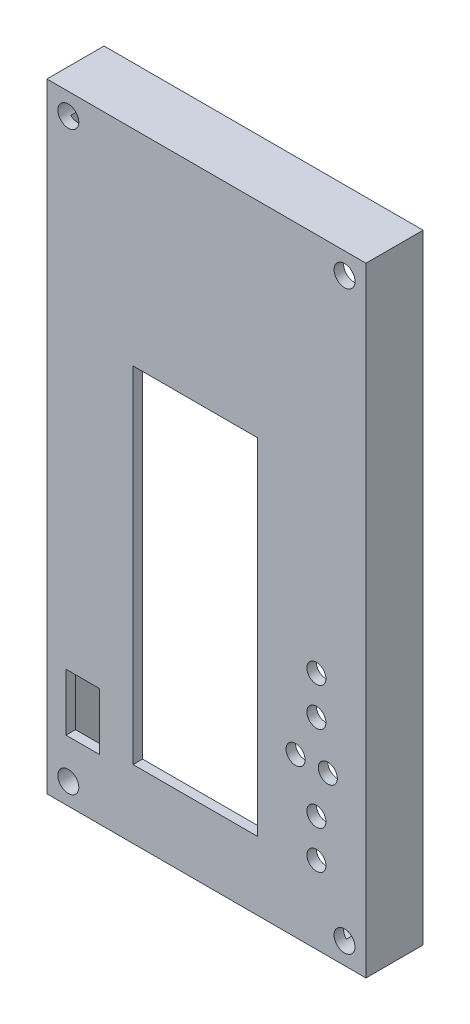
ISO-10303-21;
HEADER;
FILE_DESCRIPTION(('STEP AP214'),'2;1');
FILE_NAME('part.step','',(''),(''),'','','');
FILE_SCHEMA(('AUTOMOTIVE_DESIGN { 1 0 10303 214 1 1 1 1 }'));
ENDSEC;
DATA;
#1=APPLICATION_CONTEXT('core data for automotive mechanical design processes');
#2=APPLICATION_PROTOCOL_DEFINITION('international standard','automotive_design',2000,#1);
#3=PRODUCT_CONTEXT('',#1,'mechanical');
#4=PRODUCT('Part','Part','',(#3));
#5=PRODUCT_RELATED_PRODUCT_CATEGORY('part','',(#4));
#6=PRODUCT_DEFINITION_FORMATION('','',#4);
#7=PRODUCT_DEFINITION_CONTEXT('part definition',#1,'design');
#8=PRODUCT_DEFINITION('design','',#6,#7);
#9=PRODUCT_DEFINITION_SHAPE('','',#8);
#10=(LENGTH_UNIT() NAMED_UNIT(*) SI_UNIT(.MILLI.,.METRE.));
#11=(NAMED_UNIT(*) PLANE_ANGLE_UNIT() SI_UNIT($,.RADIAN.));
#12=(NAMED_UNIT(*) SI_UNIT($,.STERADIAN.) SOLID_ANGLE_UNIT());
#13=UNCERTAINTY_MEASURE_WITH_UNIT(LENGTH_MEASURE(1.E-05),#10,'distance_accuracy_value','');
#14=(GEOMETRIC_REPRESENTATION_CONTEXT(3) GLOBAL_UNCERTAINTY_ASSIGNED_CONTEXT((#13)) GLOBAL_UNIT_ASSIGNED_CONTEXT((#10,
#11,#12)) REPRESENTATION_CONTEXT('',''));
#15=CARTESIAN_POINT('',(0.,0.,0.));
#16=DIRECTION('',(0.,0.,1.));
#17=DIRECTION('',(1.,0.,0.));
#18=AXIS2_PLACEMENT_3D('',#15,#16,#17);
#19=CARTESIAN_POINT('',(0.,0.,0.));
#20=DIRECTION('',(0.,0.,-1.));
#21=DIRECTION('',(-1.,0.,0.));
#22=AXIS2_PLACEMENT_3D('',#19,#20,#21);
#23=PLANE('',#22);
#24=CARTESIAN_POINT('',(29.0000000000004,57.1675022635253,0.));
#25=DIRECTION('',(0.,0.,1.));
#26=DIRECTION('',(1.,0.,0.));
#27=AXIS2_PLACEMENT_3D('',#24,#25,#26);
#28=CIRCLE('',#27,2.2);
#29=CARTESIAN_POINT('',(30.5000000000004,55.5581545695822,0.));
#30=VERTEX_POINT('',#29);
#31=CARTESIAN_POINT('',(27.3906523060562,58.6675022635241,0.));
#32=VERTEX_POINT('',#31);
#33=EDGE_CURVE('E197',#30,#32,#28,.T.);
#34=ORIENTED_EDGE('',*,*,#33,.T.);
#35=DIRECTION('',(-1.,0.,0.));
#36=VECTOR('',#35,1.);
#37=CARTESIAN_POINT('',(-30.5000000000004,58.6675022635241,0.));
#38=LINE('',#37,#36);
#39=CARTESIAN_POINT('',(-27.390652306057,58.6675022635241,0.));
#40=VERTEX_POINT('',#39);
#41=EDGE_CURVE('E190',#32,#40,#38,.T.);
#42=ORIENTED_EDGE('',*,*,#41,.T.);
#43=CARTESIAN_POINT('',(-29.0000000000006,57.1675022635246,0.));
#44=DIRECTION('',(0.,0.,1.));
#45=DIRECTION('',(1.,0.,0.));
#46=AXIS2_PLACEMENT_3D('',#43,#44,#45);
#47=CIRCLE('',#46,2.2);
#48=CARTESIAN_POINT('',(-30.5000000000004,55.5581545695813,0.));
#49=VERTEX_POINT('',#48);
#50=EDGE_CURVE('E170',#40,#49,#47,.T.);
#51=ORIENTED_EDGE('',*,*,#50,.T.);
#52=DIRECTION('',(0.,-1.,0.));
#53=VECTOR('',#52,1.);
#54=CARTESIAN_POINT('',(-30.5000000000004,-65.3324977364759,0.));
#55=LINE('',#54,#53);
#56=CARTESIAN_POINT('',(-30.5000000000004,-62.2231500425326,0.));
#57=VERTEX_POINT('',#56);
#58=EDGE_CURVE('E254',#49,#57,#55,.T.);
#59=ORIENTED_EDGE('',*,*,#58,.T.);
#60=CARTESIAN_POINT('',(-29.0000000000006,-63.8324977364759,0.));
#61=DIRECTION('',(0.,0.,1.));
#62=DIRECTION('',(1.,0.,0.));
#63=AXIS2_PLACEMENT_3D('',#60,#61,#62);
#64=CIRCLE('',#63,2.2);
#65=CARTESIAN_POINT('',(-27.3906523060574,-65.3324977364759,0.));
#66=VERTEX_POINT('',#65);
#67=EDGE_CURVE('E268',#57,#66,#64,.T.);
#68=ORIENTED_EDGE('',*,*,#67,.T.);
#69=DIRECTION('',(1.,0.,0.));
#70=VECTOR('',#69,1.);
#71=CARTESIAN_POINT('',(-30.5000000000004,-65.3324977364759,0.));
#72=LINE('',#71,#70);
#73=CARTESIAN_POINT('',(27.3906523060573,-65.3324977364759,0.));
#74=VERTEX_POINT('',#73);
#75=EDGE_CURVE('E204',#66,#74,#72,.T.);
#76=ORIENTED_EDGE('',*,*,#75,.T.);
#77=CARTESIAN_POINT('',(29.0000000000004,-63.8324977364759,0.));
#78=DIRECTION('',(0.,0.,1.));
#79=DIRECTION('',(1.,0.,0.));
#80=AXIS2_PLACEMENT_3D('',#77,#78,#79);
#81=CIRCLE('',#80,2.2);
#82=CARTESIAN_POINT('',(30.5000000000004,-62.2231500425328,0.));
#83=VERTEX_POINT('',#82);
#84=EDGE_CURVE('E266',#74,#83,#81,.T.);
#85=ORIENTED_EDGE('',*,*,#84,.T.);
#86=DIRECTION('',(0.,1.,0.));
#87=VECTOR('',#86,1.);
#88=CARTESIAN_POINT('',(30.5000000000004,-65.3324977364759,0.));
#89=LINE('',#88,#87);
#90=EDGE_CURVE('E199',#83,#30,#89,.T.);
#91=ORIENTED_EDGE('',*,*,#90,.T.);
#92=EDGE_LOOP('',(#34,#42,#51,#59,#68,#76,#85,#91));
#93=FACE_BOUND('',#92,.T.);
#94=DIRECTION('',(0.,-1.,0.));
#95=VECTOR('',#94,1.);
#96=CARTESIAN_POINT('',(-33.5000000000004,-68.3324977364759,0.));
#97=LINE('',#96,#95);
#98=CARTESIAN_POINT('',(-33.5000000000004,61.6675022635241,0.));
#99=VERTEX_POINT('',#98);
#100=CARTESIAN_POINT('',(-33.5000000000004,-68.3324977364759,0.));
#101=VERTEX_POINT('',#100);
#102=EDGE_CURVE('E208',#99,#101,#97,.T.);
#103=ORIENTED_EDGE('',*,*,#102,.F.);
#104=DIRECTION('',(-1.,0.,0.));
#105=VECTOR('',#104,1.);
#106=CARTESIAN_POINT('',(-33.5000000000004,61.6675022635241,0.));
#107=LINE('',#106,#105);
#108=CARTESIAN_POINT('',(33.5000000000004,61.6675022635241,0.));
#109=VERTEX_POINT('',#108);
#110=EDGE_CURVE('E215',#109,#99,#107,.T.);
#111=ORIENTED_EDGE('',*,*,#110,.F.);
#112=DIRECTION('',(0.,1.,0.));
#113=VECTOR('',#112,1.);
#114=CARTESIAN_POINT('',(33.5000000000004,-68.3324977364759,0.));
#115=LINE('',#114,#113);
#116=CARTESIAN_POINT('',(33.5000000000004,-68.3324977364759,0.));
#117=VERTEX_POINT('',#116);
#118=EDGE_CURVE('E213',#117,#109,#115,.T.);
#119=ORIENTED_EDGE('',*,*,#118,.F.);
#120=DIRECTION('',(1.,0.,0.));
#121=VECTOR('',#120,1.);
#122=CARTESIAN_POINT('',(-33.5000000000004,-68.3324977364759,0.));
#123=LINE('',#122,#121);
#124=EDGE_CURVE('E211',#101,#117,#123,.T.);
#125=ORIENTED_EDGE('',*,*,#124,.F.);
#126=EDGE_LOOP('',(#103,#111,#119,#125));
#127=FACE_BOUND('',#126,.T.);
#128=ADVANCED_FACE('F34',(#93,#127),#23,.T.);
#129=CARTESIAN_POINT('',(-33.5000000000004,-68.3324977364759,10.));
#130=DIRECTION('',(1.,0.,0.));
#131=DIRECTION('',(0.,0.,-1.));
#132=AXIS2_PLACEMENT_3D('',#129,#130,#131);
#133=PLANE('',#132);
#134=ORIENTED_EDGE('',*,*,#102,.T.);
#135=DIRECTION('',(0.,0.,-1.));
#136=VECTOR('',#135,1.);
#137=CARTESIAN_POINT('',(-33.5000000000004,-68.3324977364759,10.));
#138=LINE('',#137,#136);
#139=CARTESIAN_POINT('',(-33.5000000000004,-68.3324977364759,12.));
#140=VERTEX_POINT('',#139);
#141=EDGE_CURVE('E11',#140,#101,#138,.T.);
#142=ORIENTED_EDGE('',*,*,#141,.F.);
#143=DIRECTION('',(0.,-1.,0.));
#144=VECTOR('',#143,1.);
#145=CARTESIAN_POINT('',(-33.5000000000004,-68.3324977364759,12.));
#146=LINE('',#145,#144);
#147=CARTESIAN_POINT('',(-33.5000000000004,61.6675022635241,12.));
#148=VERTEX_POINT('',#147);
#149=EDGE_CURVE('E241',#148,#140,#146,.T.);
#150=ORIENTED_EDGE('',*,*,#149,.F.);
#151=DIRECTION('',(0.,0.,-1.));
#152=VECTOR('',#151,1.);
#153=CARTESIAN_POINT('',(-33.5000000000004,61.6675022635241,10.));
#154=LINE('',#153,#152);
#155=EDGE_CURVE('E217',#148,#99,#154,.T.);
#156=ORIENTED_EDGE('',*,*,#155,.T.);
#157=EDGE_LOOP('',(#134,#142,#150,#156));
#158=FACE_BOUND('',#157,.T.);
#159=ADVANCED_FACE('F36',(#158),#133,.F.);
#160=CARTESIAN_POINT('',(-33.5000000000004,-68.3324977364759,10.));
#161=DIRECTION('',(0.,1.,0.));
#162=DIRECTION('',(0.,0.,1.));
#163=AXIS2_PLACEMENT_3D('',#160,#161,#162);
#164=PLANE('',#163);
#165=ORIENTED_EDGE('',*,*,#124,.T.);
#166=DIRECTION('',(0.,0.,-1.));
#167=VECTOR('',#166,1.);
#168=CARTESIAN_POINT('',(33.5000000000004,-68.3324977364759,10.));
#169=LINE('',#168,#167);
#170=CARTESIAN_POINT('',(33.5000000000004,-68.3324977364759,12.));
#171=VERTEX_POINT('',#170);
#172=EDGE_CURVE('E42',#171,#117,#169,.T.);
#173=ORIENTED_EDGE('',*,*,#172,.F.);
#174=DIRECTION('',(1.,0.,0.));
#175=VECTOR('',#174,1.);
#176=CARTESIAN_POINT('',(-33.5000000000004,-68.3324977364759,12.));
#177=LINE('',#176,#175);
#178=EDGE_CURVE('E243',#140,#171,#177,.T.);
#179=ORIENTED_EDGE('',*,*,#178,.F.);
#180=ORIENTED_EDGE('',*,*,#141,.T.);
#181=EDGE_LOOP('',(#165,#173,#179,#180));
#182=FACE_BOUND('',#181,.T.);
#183=ADVANCED_FACE('F439',(#182),#164,.F.);
#184=CARTESIAN_POINT('',(33.5000000000004,-68.3324977364759,10.));
#185=DIRECTION('',(-1.,0.,0.));
#186=DIRECTION('',(0.,0.,1.));
#187=AXIS2_PLACEMENT_3D('',#184,#185,#186);
#188=PLANE('',#187);
#189=ORIENTED_EDGE('',*,*,#118,.T.);
#190=DIRECTION('',(0.,0.,-1.));
#191=VECTOR('',#190,1.);
#192=CARTESIAN_POINT('',(33.5000000000004,61.6675022635241,10.));
#193=LINE('',#192,#191);
#194=CARTESIAN_POINT('',(33.5000000000004,61.6675022635241,12.));
#195=VERTEX_POINT('',#194);
#196=EDGE_CURVE('E220',#195,#109,#193,.T.);
#197=ORIENTED_EDGE('',*,*,#196,.F.);
#198=DIRECTION('',(0.,1.,0.));
#199=VECTOR('',#198,1.);
#200=CARTESIAN_POINT('',(33.5000000000004,-68.3324977364759,12.));
#201=LINE('',#200,#199);
#202=EDGE_CURVE('E228',#171,#195,#201,.T.);
#203=ORIENTED_EDGE('',*,*,#202,.F.);
#204=ORIENTED_EDGE('',*,*,#172,.T.);
#205=EDGE_LOOP('',(#189,#197,#203,#204));
#206=FACE_BOUND('',#205,.T.);
#207=ADVANCED_FACE('F226',(#206),#188,.F.);
#208=CARTESIAN_POINT('',(-33.5000000000004,61.6675022635241,10.));
#209=DIRECTION('',(0.,-1.,0.));
#210=DIRECTION('',(0.,0.,-1.));
#211=AXIS2_PLACEMENT_3D('',#208,#209,#210);
#212=PLANE('',#211);
#213=ORIENTED_EDGE('',*,*,#110,.T.);
#214=ORIENTED_EDGE('',*,*,#155,.F.);
#215=DIRECTION('',(-1.,0.,0.));
#216=VECTOR('',#215,1.);
#217=CARTESIAN_POINT('',(-33.5000000000004,61.6675022635241,12.));
#218=LINE('',#217,#216);
#219=EDGE_CURVE('E253',#195,#148,#218,.T.);
#220=ORIENTED_EDGE('',*,*,#219,.F.);
#221=ORIENTED_EDGE('',*,*,#196,.T.);
#222=EDGE_LOOP('',(#213,#214,#220,#221));
#223=FACE_BOUND('',#222,.T.);
#224=ADVANCED_FACE('F235',(#223),#212,.F.);
#225=CARTESIAN_POINT('',(-30.5000000000004,-65.3324977364759,10.));
#226=DIRECTION('',(1.,0.,0.));
#227=DIRECTION('',(0.,0.,-1.));
#228=AXIS2_PLACEMENT_3D('',#225,#226,#227);
#229=PLANE('',#228);
#230=DIRECTION('',(0.,0.,1.));
#231=VECTOR('',#230,1.);
#232=CARTESIAN_POINT('',(-30.5000000000004,-62.2231500425326,0.));
#233=LINE('',#232,#231);
#234=CARTESIAN_POINT('',(-30.5000000000004,-62.2231500425326,10.));
#235=VERTEX_POINT('',#234);
#236=EDGE_CURVE('E283',#57,#235,#233,.T.);
#237=ORIENTED_EDGE('',*,*,#236,.F.);
#238=ORIENTED_EDGE('',*,*,#58,.F.);
#239=DIRECTION('',(0.,0.,1.));
#240=VECTOR('',#239,1.);
#241=CARTESIAN_POINT('',(-30.5000000000004,55.5581545695813,0.));
#242=LINE('',#241,#240);
#243=CARTESIAN_POINT('',(-30.5000000000004,55.5581545695813,10.));
#244=VERTEX_POINT('',#243);
#245=EDGE_CURVE('E177',#244,#49,#242,.F.);
#246=ORIENTED_EDGE('',*,*,#245,.F.);
#247=DIRECTION('',(0.,-1.,0.));
#248=VECTOR('',#247,1.);
#249=CARTESIAN_POINT('',(-30.5000000000004,-65.3324977364759,10.));
#250=LINE('',#249,#248);
#251=EDGE_CURVE('E198',#244,#235,#250,.T.);
#252=ORIENTED_EDGE('',*,*,#251,.T.);
#253=EDGE_LOOP('',(#237,#238,#246,#252));
#254=FACE_BOUND('',#253,.T.);
#255=ADVANCED_FACE('F442',(#254),#229,.T.);
#256=CARTESIAN_POINT('',(-30.5000000000004,-65.3324977364759,10.));
#257=DIRECTION('',(0.,1.,0.));
#258=DIRECTION('',(0.,0.,1.));
#259=AXIS2_PLACEMENT_3D('',#256,#257,#258);
#260=PLANE('',#259);
#261=DIRECTION('',(0.,0.,1.));
#262=VECTOR('',#261,1.);
#263=CARTESIAN_POINT('',(-27.3906523060574,-65.3324977364759,0.));
#264=LINE('',#263,#262);
#265=CARTESIAN_POINT('',(-27.3906523060574,-65.3324977364759,10.));
#266=VERTEX_POINT('',#265);
#267=EDGE_CURVE('E272',#266,#66,#264,.F.);
#268=ORIENTED_EDGE('',*,*,#267,.F.);
#269=DIRECTION('',(1.,0.,0.));
#270=VECTOR('',#269,1.);
#271=CARTESIAN_POINT('',(-30.5000000000004,-65.3324977364759,10.));
#272=LINE('',#271,#270);
#273=CARTESIAN_POINT('',(27.3906523060573,-65.3324977364759,10.));
#274=VERTEX_POINT('',#273);
#275=EDGE_CURVE('E202',#266,#274,#272,.T.);
#276=ORIENTED_EDGE('',*,*,#275,.T.);
#277=DIRECTION('',(0.,0.,1.));
#278=VECTOR('',#277,1.);
#279=CARTESIAN_POINT('',(27.3906523060573,-65.3324977364759,0.));
#280=LINE('',#279,#278);
#281=EDGE_CURVE('E49',#74,#274,#280,.T.);
#282=ORIENTED_EDGE('',*,*,#281,.F.);
#283=ORIENTED_EDGE('',*,*,#75,.F.);
#284=EDGE_LOOP('',(#268,#276,#282,#283));
#285=FACE_BOUND('',#284,.T.);
#286=ADVANCED_FACE('F271',(#285),#260,.T.);
#287=CARTESIAN_POINT('',(30.5000000000004,-65.3324977364759,10.));
#288=DIRECTION('',(-1.,0.,0.));
#289=DIRECTION('',(0.,-1.,0.));
#290=AXIS2_PLACEMENT_3D('',#287,#288,#289);
#291=PLANE('',#290);
#292=DIRECTION('',(0.,0.,1.));
#293=VECTOR('',#292,1.);
#294=CARTESIAN_POINT('',(30.5000000000004,55.5581545695822,0.));
#295=LINE('',#294,#293);
#296=CARTESIAN_POINT('',(30.5000000000004,55.5581545695822,10.));
#297=VERTEX_POINT('',#296);
#298=EDGE_CURVE('E57',#30,#297,#295,.T.);
#299=ORIENTED_EDGE('',*,*,#298,.F.);
#300=ORIENTED_EDGE('',*,*,#90,.F.);
#301=DIRECTION('',(0.,0.,1.));
#302=VECTOR('',#301,1.);
#303=CARTESIAN_POINT('',(30.5000000000004,-62.2231500425328,0.));
#304=LINE('',#303,#302);
#305=CARTESIAN_POINT('',(30.5000000000004,-62.2231500425328,10.));
#306=VERTEX_POINT('',#305);
#307=EDGE_CURVE('E275',#306,#83,#304,.F.);
#308=ORIENTED_EDGE('',*,*,#307,.F.);
#309=DIRECTION('',(0.,1.,0.));
#310=VECTOR('',#309,1.);
#311=CARTESIAN_POINT('',(30.5000000000004,-65.3324977364759,10.));
#312=LINE('',#311,#310);
#313=EDGE_CURVE('E258',#306,#297,#312,.T.);
#314=ORIENTED_EDGE('',*,*,#313,.T.);
#315=EDGE_LOOP('',(#299,#300,#308,#314));
#316=FACE_BOUND('',#315,.T.);
#317=ADVANCED_FACE('F473',(#316),#291,.T.);
#318=CARTESIAN_POINT('',(-30.5000000000004,58.6675022635241,10.));
#319=DIRECTION('',(0.,-1.,0.));
#320=DIRECTION('',(0.,0.,-1.));
#321=AXIS2_PLACEMENT_3D('',#318,#319,#320);
#322=PLANE('',#321);
#323=DIRECTION('',(0.,0.,1.));
#324=VECTOR('',#323,1.);
#325=CARTESIAN_POINT('',(27.3906523060562,58.6675022635241,0.));
#326=LINE('',#325,#324);
#327=CARTESIAN_POINT('',(27.3906523060562,58.6675022635241,10.));
#328=VERTEX_POINT('',#327);
#329=EDGE_CURVE('E287',#328,#32,#326,.F.);
#330=ORIENTED_EDGE('',*,*,#329,.F.);
#331=DIRECTION('',(-1.,0.,0.));
#332=VECTOR('',#331,1.);
#333=CARTESIAN_POINT('',(-30.5000000000004,58.6675022635241,10.));
#334=LINE('',#333,#332);
#335=CARTESIAN_POINT('',(-27.390652306057,58.6675022635241,10.));
#336=VERTEX_POINT('',#335);
#337=EDGE_CURVE('E192',#328,#336,#334,.T.);
#338=ORIENTED_EDGE('',*,*,#337,.T.);
#339=DIRECTION('',(0.,0.,1.));
#340=VECTOR('',#339,1.);
#341=CARTESIAN_POINT('',(-27.390652306057,58.6675022635241,0.));
#342=LINE('',#341,#340);
#343=EDGE_CURVE('E174',#40,#336,#342,.T.);
#344=ORIENTED_EDGE('',*,*,#343,.F.);
#345=ORIENTED_EDGE('',*,*,#41,.F.);
#346=EDGE_LOOP('',(#330,#338,#344,#345));
#347=FACE_BOUND('',#346,.T.);
#348=ADVANCED_FACE('F189',(#347),#322,.T.);
#349=CARTESIAN_POINT('',(0.,0.,10.));
#350=DIRECTION('',(0.,0.,-1.));
#351=DIRECTION('',(-1.,0.,0.));
#352=AXIS2_PLACEMENT_3D('',#349,#350,#351);
#353=PLANE('',#352);
#354=CARTESIAN_POINT('',(29.0000000000004,57.1675022635253,10.));
#355=DIRECTION('',(0.,0.,-1.));
#356=DIRECTION('',(-1.,0.,0.));
#357=AXIS2_PLACEMENT_3D('',#354,#355,#356);
#358=CIRCLE('',#357,2.2);
#359=EDGE_CURVE('E285',#297,#328,#358,.T.);
#360=ORIENTED_EDGE('',*,*,#359,.F.);
#361=ORIENTED_EDGE('',*,*,#313,.F.);
#362=CARTESIAN_POINT('',(29.0000000000004,-63.8324977364759,10.));
#363=DIRECTION('',(0.,0.,-1.));
#364=DIRECTION('',(-1.,0.,0.));
#365=AXIS2_PLACEMENT_3D('',#362,#363,#364);
#366=CIRCLE('',#365,2.2);
#367=EDGE_CURVE('E278',#274,#306,#366,.T.);
#368=ORIENTED_EDGE('',*,*,#367,.F.);
#369=ORIENTED_EDGE('',*,*,#275,.F.);
#370=CARTESIAN_POINT('',(-29.0000000000006,-63.8324977364759,10.));
#371=DIRECTION('',(0.,0.,-1.));
#372=DIRECTION('',(-1.,0.,0.));
#373=AXIS2_PLACEMENT_3D('',#370,#371,#372);
#374=CIRCLE('',#373,2.2);
#375=EDGE_CURVE('E274',#235,#266,#374,.T.);
#376=ORIENTED_EDGE('',*,*,#375,.F.);
#377=ORIENTED_EDGE('',*,*,#251,.F.);
#378=CARTESIAN_POINT('',(-29.0000000000006,57.1675022635246,10.));
#379=DIRECTION('',(0.,0.,-1.));
#380=DIRECTION('',(-1.,0.,0.));
#381=AXIS2_PLACEMENT_3D('',#378,#379,#380);
#382=CIRCLE('',#381,2.2);
#383=EDGE_CURVE('E182',#336,#244,#382,.T.);
#384=ORIENTED_EDGE('',*,*,#383,.F.);
#385=ORIENTED_EDGE('',*,*,#337,.F.);
#386=EDGE_LOOP('',(#360,#361,#368,#369,#376,#377,#384,#385));
#387=FACE_BOUND('',#386,.T.);
#388=CARTESIAN_POINT('',(23.0964500000001,-52.1195522635235,10.));
#389=DIRECTION('',(0.,0.,-1.));
#390=DIRECTION('',(-1.,0.,0.));
#391=AXIS2_PLACEMENT_3D('',#388,#389,#390);
#392=CIRCLE('',#391,2.);
#393=CARTESIAN_POINT('',(21.0964500000001,-52.1195522635235,10.));
#394=VERTEX_POINT('',#393);
#395=EDGE_CURVE('E323',#394,#394,#392,.T.);
#396=ORIENTED_EDGE('',*,*,#395,.F.);
#397=EDGE_LOOP('',(#396));
#398=FACE_BOUND('',#397,.T.);
#399=CARTESIAN_POINT('',(23.0964499999998,-26.1154522635235,10.));
#400=DIRECTION('',(0.,0.,-1.));
#401=DIRECTION('',(-1.,0.,0.));
#402=AXIS2_PLACEMENT_3D('',#399,#400,#401);
#403=CIRCLE('',#402,2.);
#404=CARTESIAN_POINT('',(21.0964499999998,-26.1154522635235,10.));
#405=VERTEX_POINT('',#404);
#406=EDGE_CURVE('E320',#405,#405,#403,.T.);
#407=ORIENTED_EDGE('',*,*,#406,.F.);
#408=EDGE_LOOP('',(#407));
#409=FACE_BOUND('',#408,.T.);
#410=CARTESIAN_POINT('',(18.7156472457008,-35.0638056060374,10.));
#411=DIRECTION('',(0.,0.,-1.));
#412=DIRECTION('',(-1.,0.,0.));
#413=AXIS2_PLACEMENT_3D('',#410,#411,#412);
#414=CIRCLE('',#413,2.);
#415=CARTESIAN_POINT('',(16.7156472457008,-35.0638056060374,10.));
#416=VERTEX_POINT('',#415);
#417=EDGE_CURVE('E317',#416,#416,#414,.T.);
#418=ORIENTED_EDGE('',*,*,#417,.F.);
#419=EDGE_LOOP('',(#418));
#420=FACE_BOUND('',#419,.T.);
#421=CARTESIAN_POINT('',(25.4964635542668,-35.0661063612734,10.));
#422=DIRECTION('',(0.,0.,-1.));
#423=DIRECTION('',(-1.,0.,0.));
#424=AXIS2_PLACEMENT_3D('',#421,#422,#423);
#425=CIRCLE('',#424,2.);
#426=CARTESIAN_POINT('',(23.4964635542668,-35.0661063612734,10.));
#427=VERTEX_POINT('',#426);
#428=EDGE_CURVE('E314',#427,#427,#425,.T.);
#429=ORIENTED_EDGE('',*,*,#428,.F.);
#430=EDGE_LOOP('',(#429));
#431=FACE_BOUND('',#430,.T.);
#432=CARTESIAN_POINT('',(23.09645,-44.1154522635235,10.));
#433=DIRECTION('',(0.,0.,-1.));
#434=DIRECTION('',(-1.,0.,0.));
#435=AXIS2_PLACEMENT_3D('',#432,#433,#434);
#436=CIRCLE('',#435,2.);
#437=CARTESIAN_POINT('',(21.09645,-44.1154522635235,10.));
#438=VERTEX_POINT('',#437);
#439=EDGE_CURVE('E311',#438,#438,#436,.T.);
#440=ORIENTED_EDGE('',*,*,#439,.F.);
#441=EDGE_LOOP('',(#440));
#442=FACE_BOUND('',#441,.T.);
#443=CARTESIAN_POINT('',(23.0964499999997,-18.1154522635235,10.));
#444=DIRECTION('',(0.,0.,-1.));
#445=DIRECTION('',(-1.,0.,0.));
#446=AXIS2_PLACEMENT_3D('',#443,#444,#445);
#447=CIRCLE('',#446,2.);
#448=CARTESIAN_POINT('',(21.0964499999997,-18.1154522635235,10.));
#449=VERTEX_POINT('',#448);
#450=EDGE_CURVE('E294',#449,#449,#447,.T.);
#451=ORIENTED_EDGE('',*,*,#450,.F.);
#452=EDGE_LOOP('',(#451));
#453=FACE_BOUND('',#452,.T.);
#454=DIRECTION('',(-1.,0.,0.));
#455=VECTOR('',#454,1.);
#456=CARTESIAN_POINT('',(-29.5000000000004,-43.6675022664759,10.));
#457=LINE('',#456,#455);
#458=CARTESIAN_POINT('',(-22.5000000000004,-43.6675022664759,10.));
#459=VERTEX_POINT('',#458);
#460=CARTESIAN_POINT('',(-29.5000000000004,-43.6675022664759,10.));
#461=VERTEX_POINT('',#460);
#462=EDGE_CURVE('E330',#459,#461,#457,.T.);
#463=ORIENTED_EDGE('',*,*,#462,.T.);
#464=DIRECTION('',(0.,-1.,0.));
#465=VECTOR('',#464,1.);
#466=CARTESIAN_POINT('',(-29.5000000000004,-55.6675022635241,10.));
#467=LINE('',#466,#465);
#468=CARTESIAN_POINT('',(-29.5000000000004,-55.6675022635241,10.));
#469=VERTEX_POINT('',#468);
#470=EDGE_CURVE('E326',#461,#469,#467,.T.);
#471=ORIENTED_EDGE('',*,*,#470,.T.);
#472=DIRECTION('',(1.,0.,0.));
#473=VECTOR('',#472,1.);
#474=CARTESIAN_POINT('',(-29.5000000000004,-55.6675022635241,10.));
#475=LINE('',#474,#473);
#476=CARTESIAN_POINT('',(-22.5000000000004,-55.6675022635241,10.));
#477=VERTEX_POINT('',#476);
#478=EDGE_CURVE('E340',#469,#477,#475,.T.);
#479=ORIENTED_EDGE('',*,*,#478,.T.);
#480=DIRECTION('',(0.,1.,0.));
#481=VECTOR('',#480,1.);
#482=CARTESIAN_POINT('',(-22.5000000000004,-55.6675022635241,10.));
#483=LINE('',#482,#481);
#484=EDGE_CURVE('E343',#477,#459,#483,.T.);
#485=ORIENTED_EDGE('',*,*,#484,.T.);
#486=EDGE_LOOP('',(#463,#471,#479,#485));
#487=FACE_BOUND('',#486,.T.);
#488=DIRECTION('',(-1.,0.,0.));
#489=VECTOR('',#488,1.);
#490=CARTESIAN_POINT('',(-15.4000000000004,18.5324977364759,10.));
#491=LINE('',#490,#489);
#492=CARTESIAN_POINT('',(10.6999999999996,18.5324977364759,10.));
#493=VERTEX_POINT('',#492);
#494=CARTESIAN_POINT('',(-15.4000000000004,18.5324977364759,10.));
#495=VERTEX_POINT('',#494);
#496=EDGE_CURVE('E361',#493,#495,#491,.T.);
#497=ORIENTED_EDGE('',*,*,#496,.T.);
#498=DIRECTION('',(0.,-1.,0.));
#499=VECTOR('',#498,1.);
#500=CARTESIAN_POINT('',(-15.4000000000004,-53.9675022635241,10.));
#501=LINE('',#500,#499);
#502=CARTESIAN_POINT('',(-15.4000000000004,-53.9675022635241,10.));
#503=VERTEX_POINT('',#502);
#504=EDGE_CURVE('E357',#495,#503,#501,.T.);
#505=ORIENTED_EDGE('',*,*,#504,.T.);
#506=DIRECTION('',(1.,0.,0.));
#507=VECTOR('',#506,1.);
#508=CARTESIAN_POINT('',(-15.4000000000004,-53.9675022635241,10.));
#509=LINE('',#508,#507);
#510=CARTESIAN_POINT('',(10.6999999999996,-53.9675022635241,10.));
#511=VERTEX_POINT('',#510);
#512=EDGE_CURVE('E371',#503,#511,#509,.T.);
#513=ORIENTED_EDGE('',*,*,#512,.T.);
#514=DIRECTION('',(0.,1.,0.));
#515=VECTOR('',#514,1.);
#516=CARTESIAN_POINT('',(10.6999999999996,-53.9675022635241,10.));
#517=LINE('',#516,#515);
#518=EDGE_CURVE('E374',#511,#493,#517,.T.);
#519=ORIENTED_EDGE('',*,*,#518,.T.);
#520=EDGE_LOOP('',(#497,#505,#513,#519));
#521=FACE_BOUND('',#520,.T.);
#522=ADVANCED_FACE('F393',(#387,#398,#409,#420,#431,#442,#453,#487,#521),#353,.T.);
#523=CARTESIAN_POINT('',(0.,0.,12.));
#524=DIRECTION('',(0.,0.,-1.));
#525=DIRECTION('',(-1.,0.,0.));
#526=AXIS2_PLACEMENT_3D('',#523,#524,#525);
#527=PLANE('',#526);
#528=CARTESIAN_POINT('',(29.0000000000004,57.1675022635253,12.));
#529=DIRECTION('',(0.,0.,1.));
#530=DIRECTION('',(1.,0.,0.));
#531=AXIS2_PLACEMENT_3D('',#528,#529,#530);
#532=CIRCLE('',#531,2.2);
#533=CARTESIAN_POINT('',(31.2000000000004,57.1675022635253,12.));
#534=VERTEX_POINT('',#533);
#535=EDGE_CURVE('E690',#534,#534,#532,.T.);
#536=ORIENTED_EDGE('',*,*,#535,.F.);
#537=EDGE_LOOP('',(#536));
#538=FACE_BOUND('',#537,.T.);
#539=CARTESIAN_POINT('',(-29.0000000000006,-63.8324977364759,12.));
#540=DIRECTION('',(0.,0.,1.));
#541=DIRECTION('',(1.,0.,0.));
#542=AXIS2_PLACEMENT_3D('',#539,#540,#541);
#543=CIRCLE('',#542,2.2);
#544=CARTESIAN_POINT('',(-26.8000000000005,-63.8324977364759,12.));
#545=VERTEX_POINT('',#544);
#546=EDGE_CURVE('E693',#545,#545,#543,.T.);
#547=ORIENTED_EDGE('',*,*,#546,.F.);
#548=EDGE_LOOP('',(#547));
#549=FACE_BOUND('',#548,.T.);
#550=CARTESIAN_POINT('',(29.0000000000004,-63.8324977364759,12.));
#551=DIRECTION('',(0.,0.,1.));
#552=DIRECTION('',(1.,0.,0.));
#553=AXIS2_PLACEMENT_3D('',#550,#551,#552);
#554=CIRCLE('',#553,2.2);
#555=CARTESIAN_POINT('',(31.2000000000004,-63.8324977364759,12.));
#556=VERTEX_POINT('',#555);
#557=EDGE_CURVE('E716',#556,#556,#554,.T.);
#558=ORIENTED_EDGE('',*,*,#557,.F.);
#559=EDGE_LOOP('',(#558));
#560=FACE_BOUND('',#559,.T.);
#561=CARTESIAN_POINT('',(-29.0000000000006,57.1675022635246,12.));
#562=DIRECTION('',(0.,0.,1.));
#563=DIRECTION('',(1.,0.,0.));
#564=AXIS2_PLACEMENT_3D('',#561,#562,#563);
#565=CIRCLE('',#564,2.2);
#566=CARTESIAN_POINT('',(-26.8000000000005,57.1675022635246,12.));
#567=VERTEX_POINT('',#566);
#568=EDGE_CURVE('E183',#567,#567,#565,.T.);
#569=ORIENTED_EDGE('',*,*,#568,.F.);
#570=EDGE_LOOP('',(#569));
#571=FACE_BOUND('',#570,.T.);
#572=CARTESIAN_POINT('',(23.0964500000001,-52.1195522635235,12.));
#573=DIRECTION('',(0.,0.,1.));
#574=DIRECTION('',(1.,0.,0.));
#575=AXIS2_PLACEMENT_3D('',#572,#573,#574);
#576=CIRCLE('',#575,2.);
#577=CARTESIAN_POINT('',(25.0964500000001,-52.1195522635235,12.));
#578=VERTEX_POINT('',#577);
#579=EDGE_CURVE('E291',#578,#578,#576,.T.);
#580=ORIENTED_EDGE('',*,*,#579,.F.);
#581=EDGE_LOOP('',(#580));
#582=FACE_BOUND('',#581,.T.);
#583=CARTESIAN_POINT('',(23.0964499999998,-26.1154522635235,12.));
#584=DIRECTION('',(0.,0.,1.));
#585=DIRECTION('',(1.,0.,0.));
#586=AXIS2_PLACEMENT_3D('',#583,#584,#585);
#587=CIRCLE('',#586,2.);
#588=CARTESIAN_POINT('',(25.0964499999998,-26.1154522635235,12.));
#589=VERTEX_POINT('',#588);
#590=EDGE_CURVE('E300',#589,#589,#587,.T.);
#591=ORIENTED_EDGE('',*,*,#590,.F.);
#592=EDGE_LOOP('',(#591));
#593=FACE_BOUND('',#592,.T.);
#594=CARTESIAN_POINT('',(18.7156472457008,-35.0638056060374,12.));
#595=DIRECTION('',(0.,0.,1.));
#596=DIRECTION('',(1.,0.,0.));
#597=AXIS2_PLACEMENT_3D('',#594,#595,#596);
#598=CIRCLE('',#597,2.);
#599=CARTESIAN_POINT('',(20.7156472457008,-35.0638056060374,12.));
#600=VERTEX_POINT('',#599);
#601=EDGE_CURVE('E296',#600,#600,#598,.T.);
#602=ORIENTED_EDGE('',*,*,#601,.F.);
#603=EDGE_LOOP('',(#602));
#604=FACE_BOUND('',#603,.T.);
#605=CARTESIAN_POINT('',(25.4964635542668,-35.0661063612734,12.));
#606=DIRECTION('',(0.,0.,1.));
#607=DIRECTION('',(1.,0.,0.));
#608=AXIS2_PLACEMENT_3D('',#605,#606,#607);
#609=CIRCLE('',#608,2.);
#610=CARTESIAN_POINT('',(27.4964635542668,-35.0661063612734,12.));
#611=VERTEX_POINT('',#610);
#612=EDGE_CURVE('E299',#611,#611,#609,.T.);
#613=ORIENTED_EDGE('',*,*,#612,.F.);
#614=EDGE_LOOP('',(#613));
#615=FACE_BOUND('',#614,.T.);
#616=CARTESIAN_POINT('',(23.09645,-44.1154522635235,12.));
#617=DIRECTION('',(0.,0.,1.));
#618=DIRECTION('',(1.,0.,0.));
#619=AXIS2_PLACEMENT_3D('',#616,#617,#618);
#620=CIRCLE('',#619,2.);
#621=CARTESIAN_POINT('',(25.09645,-44.1154522635235,12.));
#622=VERTEX_POINT('',#621);
#623=EDGE_CURVE('E295',#622,#622,#620,.T.);
#624=ORIENTED_EDGE('',*,*,#623,.F.);
#625=EDGE_LOOP('',(#624));
#626=FACE_BOUND('',#625,.T.);
#627=CARTESIAN_POINT('',(23.0964499999997,-18.1154522635235,12.));
#628=DIRECTION('',(0.,0.,1.));
#629=DIRECTION('',(1.,0.,0.));
#630=AXIS2_PLACEMENT_3D('',#627,#628,#629);
#631=CIRCLE('',#630,2.);
#632=CARTESIAN_POINT('',(25.0964499999997,-18.1154522635235,12.));
#633=VERTEX_POINT('',#632);
#634=EDGE_CURVE('E290',#633,#633,#631,.T.);
#635=ORIENTED_EDGE('',*,*,#634,.F.);
#636=EDGE_LOOP('',(#635));
#637=FACE_BOUND('',#636,.T.);
#638=DIRECTION('',(0.,-1.,0.));
#639=VECTOR('',#638,1.);
#640=CARTESIAN_POINT('',(-15.4000000000004,-53.9675022635241,12.));
#641=LINE('',#640,#639);
#642=CARTESIAN_POINT('',(-15.4000000000004,18.5324977364759,12.));
#643=VERTEX_POINT('',#642);
#644=CARTESIAN_POINT('',(-15.4000000000004,-53.9675022635241,12.));
#645=VERTEX_POINT('',#644);
#646=EDGE_CURVE('E358',#643,#645,#641,.T.);
#647=ORIENTED_EDGE('',*,*,#646,.F.);
#648=DIRECTION('',(-1.,0.,0.));
#649=VECTOR('',#648,1.);
#650=CARTESIAN_POINT('',(-15.4000000000004,18.5324977364759,12.));
#651=LINE('',#650,#649);
#652=CARTESIAN_POINT('',(10.6999999999996,18.5324977364759,12.));
#653=VERTEX_POINT('',#652);
#654=EDGE_CURVE('E366',#653,#643,#651,.T.);
#655=ORIENTED_EDGE('',*,*,#654,.F.);
#656=DIRECTION('',(0.,1.,0.));
#657=VECTOR('',#656,1.);
#658=CARTESIAN_POINT('',(10.6999999999996,-53.9675022635241,12.));
#659=LINE('',#658,#657);
#660=CARTESIAN_POINT('',(10.6999999999996,-53.9675022635241,12.));
#661=VERTEX_POINT('',#660);
#662=EDGE_CURVE('E363',#661,#653,#659,.T.);
#663=ORIENTED_EDGE('',*,*,#662,.F.);
#664=DIRECTION('',(1.,0.,0.));
#665=VECTOR('',#664,1.);
#666=CARTESIAN_POINT('',(-15.4000000000004,-53.9675022635241,12.));
#667=LINE('',#666,#665);
#668=EDGE_CURVE('E360',#645,#661,#667,.T.);
#669=ORIENTED_EDGE('',*,*,#668,.F.);
#670=EDGE_LOOP('',(#647,#655,#663,#669));
#671=FACE_BOUND('',#670,.T.);
#672=ORIENTED_EDGE('',*,*,#149,.T.);
#673=ORIENTED_EDGE('',*,*,#178,.T.);
#674=ORIENTED_EDGE('',*,*,#202,.T.);
#675=ORIENTED_EDGE('',*,*,#219,.T.);
#676=EDGE_LOOP('',(#672,#673,#674,#675));
#677=FACE_BOUND('',#676,.T.);
#678=DIRECTION('',(0.,-1.,0.));
#679=VECTOR('',#678,1.);
#680=CARTESIAN_POINT('',(-29.5000000000004,-55.6675022635241,12.));
#681=LINE('',#680,#679);
#682=CARTESIAN_POINT('',(-29.5000000000004,-43.6675022664759,12.));
#683=VERTEX_POINT('',#682);
#684=CARTESIAN_POINT('',(-29.5000000000004,-55.6675022635241,12.));
#685=VERTEX_POINT('',#684);
#686=EDGE_CURVE('E327',#683,#685,#681,.T.);
#687=ORIENTED_EDGE('',*,*,#686,.F.);
#688=DIRECTION('',(-1.,0.,0.));
#689=VECTOR('',#688,1.);
#690=CARTESIAN_POINT('',(-29.5000000000004,-43.6675022664759,12.));
#691=LINE('',#690,#689);
#692=CARTESIAN_POINT('',(-22.5000000000004,-43.6675022664759,12.));
#693=VERTEX_POINT('',#692);
#694=EDGE_CURVE('E335',#693,#683,#691,.T.);
#695=ORIENTED_EDGE('',*,*,#694,.F.);
#696=DIRECTION('',(0.,1.,0.));
#697=VECTOR('',#696,1.);
#698=CARTESIAN_POINT('',(-22.5000000000004,-55.6675022635241,12.));
#699=LINE('',#698,#697);
#700=CARTESIAN_POINT('',(-22.5000000000004,-55.6675022635241,12.));
#701=VERTEX_POINT('',#700);
#702=EDGE_CURVE('E332',#701,#693,#699,.T.);
#703=ORIENTED_EDGE('',*,*,#702,.F.);
#704=DIRECTION('',(1.,0.,0.));
#705=VECTOR('',#704,1.);
#706=CARTESIAN_POINT('',(-29.5000000000004,-55.6675022635241,12.));
#707=LINE('',#706,#705);
#708=EDGE_CURVE('E329',#685,#701,#707,.T.);
#709=ORIENTED_EDGE('',*,*,#708,.F.);
#710=EDGE_LOOP('',(#687,#695,#703,#709));
#711=FACE_BOUND('',#710,.T.);
#712=ADVANCED_FACE('F402',(#538,#549,#560,#571,#582,#593,#604,#615,#626,#637,#671,#677,#711),
#527,.F.);
#713=CARTESIAN_POINT('',(-15.4000000000004,-53.9675022635241,12.));
#714=DIRECTION('',(1.,0.,0.));
#715=DIRECTION('',(0.,0.,-1.));
#716=AXIS2_PLACEMENT_3D('',#713,#714,#715);
#717=PLANE('',#716);
#718=ORIENTED_EDGE('',*,*,#504,.F.);
#719=DIRECTION('',(0.,0.,-1.));
#720=VECTOR('',#719,1.);
#721=CARTESIAN_POINT('',(-15.4000000000004,18.5324977364759,12.));
#722=LINE('',#721,#720);
#723=EDGE_CURVE('E368',#643,#495,#722,.T.);
#724=ORIENTED_EDGE('',*,*,#723,.F.);
#725=ORIENTED_EDGE('',*,*,#646,.T.);
#726=DIRECTION('',(0.,0.,-1.));
#727=VECTOR('',#726,1.);
#728=CARTESIAN_POINT('',(-15.4000000000004,-53.9675022635241,12.));
#729=LINE('',#728,#727);
#730=EDGE_CURVE('E244',#645,#503,#729,.T.);
#731=ORIENTED_EDGE('',*,*,#730,.T.);
#732=EDGE_LOOP('',(#718,#724,#725,#731));
#733=FACE_BOUND('',#732,.T.);
#734=ADVANCED_FACE('F396',(#733),#717,.T.);
#735=CARTESIAN_POINT('',(-15.4000000000004,-53.9675022635241,12.));
#736=DIRECTION('',(0.,1.,0.));
#737=DIRECTION('',(0.,0.,1.));
#738=AXIS2_PLACEMENT_3D('',#735,#736,#737);
#739=PLANE('',#738);
#740=ORIENTED_EDGE('',*,*,#512,.F.);
#741=ORIENTED_EDGE('',*,*,#730,.F.);
#742=ORIENTED_EDGE('',*,*,#668,.T.);
#743=DIRECTION('',(0.,0.,-1.));
#744=VECTOR('',#743,1.);
#745=CARTESIAN_POINT('',(10.6999999999996,-53.9675022635241,12.));
#746=LINE('',#745,#744);
#747=EDGE_CURVE('E248',#661,#511,#746,.T.);
#748=ORIENTED_EDGE('',*,*,#747,.T.);
#749=EDGE_LOOP('',(#740,#741,#742,#748));
#750=FACE_BOUND('',#749,.T.);
#751=ADVANCED_FACE('F385',(#750),#739,.T.);
#752=CARTESIAN_POINT('',(10.6999999999996,-53.9675022635241,12.));
#753=DIRECTION('',(-1.,0.,0.));
#754=DIRECTION('',(0.,0.,1.));
#755=AXIS2_PLACEMENT_3D('',#752,#753,#754);
#756=PLANE('',#755);
#757=ORIENTED_EDGE('',*,*,#518,.F.);
#758=ORIENTED_EDGE('',*,*,#747,.F.);
#759=ORIENTED_EDGE('',*,*,#662,.T.);
#760=DIRECTION('',(0.,0.,-1.));
#761=VECTOR('',#760,1.);
#762=CARTESIAN_POINT('',(10.6999999999996,18.5324977364759,12.));
#763=LINE('',#762,#761);
#764=EDGE_CURVE('E381',#653,#493,#763,.T.);
#765=ORIENTED_EDGE('',*,*,#764,.T.);
#766=EDGE_LOOP('',(#757,#758,#759,#765));
#767=FACE_BOUND('',#766,.T.);
#768=ADVANCED_FACE('F390',(#767),#756,.T.);
#769=CARTESIAN_POINT('',(-15.4000000000004,18.5324977364759,12.));
#770=DIRECTION('',(0.,-1.,0.));
#771=DIRECTION('',(0.,0.,-1.));
#772=AXIS2_PLACEMENT_3D('',#769,#770,#771);
#773=PLANE('',#772);
#774=ORIENTED_EDGE('',*,*,#496,.F.);
#775=ORIENTED_EDGE('',*,*,#764,.F.);
#776=ORIENTED_EDGE('',*,*,#654,.T.);
#777=ORIENTED_EDGE('',*,*,#723,.T.);
#778=EDGE_LOOP('',(#774,#775,#776,#777));
#779=FACE_BOUND('',#778,.T.);
#780=ADVANCED_FACE('F399',(#779),#773,.T.);
#781=CARTESIAN_POINT('',(-29.5000000000004,-55.6675022635241,12.));
#782=DIRECTION('',(1.,0.,0.));
#783=DIRECTION('',(0.,0.,-1.));
#784=AXIS2_PLACEMENT_3D('',#781,#782,#783);
#785=PLANE('',#784);
#786=ORIENTED_EDGE('',*,*,#470,.F.);
#787=DIRECTION('',(0.,0.,-1.));
#788=VECTOR('',#787,1.);
#789=CARTESIAN_POINT('',(-29.5000000000004,-43.6675022664759,12.));
#790=LINE('',#789,#788);
#791=EDGE_CURVE('E337',#683,#461,#790,.T.);
#792=ORIENTED_EDGE('',*,*,#791,.F.);
#793=ORIENTED_EDGE('',*,*,#686,.T.);
#794=DIRECTION('',(0.,0.,-1.));
#795=VECTOR('',#794,1.);
#796=CARTESIAN_POINT('',(-29.5000000000004,-55.6675022635241,12.));
#797=LINE('',#796,#795);
#798=EDGE_CURVE('E354',#685,#469,#797,.T.);
#799=ORIENTED_EDGE('',*,*,#798,.T.);
#800=EDGE_LOOP('',(#786,#792,#793,#799));
#801=FACE_BOUND('',#800,.T.);
#802=ADVANCED_FACE('F414',(#801),#785,.T.);
#803=CARTESIAN_POINT('',(-29.5000000000004,-55.6675022635241,12.));
#804=DIRECTION('',(0.,1.,0.));
#805=DIRECTION('',(0.,0.,1.));
#806=AXIS2_PLACEMENT_3D('',#803,#804,#805);
#807=PLANE('',#806);
#808=ORIENTED_EDGE('',*,*,#478,.F.);
#809=ORIENTED_EDGE('',*,*,#798,.F.);
#810=ORIENTED_EDGE('',*,*,#708,.T.);
#811=DIRECTION('',(0.,0.,-1.));
#812=VECTOR('',#811,1.);
#813=CARTESIAN_POINT('',(-22.5000000000004,-55.6675022635241,12.));
#814=LINE('',#813,#812);
#815=EDGE_CURVE('E352',#701,#477,#814,.T.);
#816=ORIENTED_EDGE('',*,*,#815,.T.);
#817=EDGE_LOOP('',(#808,#809,#810,#816));
#818=FACE_BOUND('',#817,.T.);
#819=ADVANCED_FACE('F416',(#818),#807,.T.);
#820=CARTESIAN_POINT('',(-22.5000000000004,-55.6675022635241,12.));
#821=DIRECTION('',(-1.,0.,0.));
#822=DIRECTION('',(0.,0.,1.));
#823=AXIS2_PLACEMENT_3D('',#820,#821,#822);
#824=PLANE('',#823);
#825=ORIENTED_EDGE('',*,*,#484,.F.);
#826=ORIENTED_EDGE('',*,*,#815,.F.);
#827=ORIENTED_EDGE('',*,*,#702,.T.);
#828=DIRECTION('',(0.,0.,-1.));
#829=VECTOR('',#828,1.);
#830=CARTESIAN_POINT('',(-22.5000000000004,-43.6675022664759,12.));
#831=LINE('',#830,#829);
#832=EDGE_CURVE('E350',#693,#459,#831,.T.);
#833=ORIENTED_EDGE('',*,*,#832,.T.);
#834=EDGE_LOOP('',(#825,#826,#827,#833));
#835=FACE_BOUND('',#834,.T.);
#836=ADVANCED_FACE('F424',(#835),#824,.T.);
#837=CARTESIAN_POINT('',(-29.5000000000004,-43.6675022664759,12.));
#838=DIRECTION('',(0.,-1.,0.));
#839=DIRECTION('',(0.,0.,-1.));
#840=AXIS2_PLACEMENT_3D('',#837,#838,#839);
#841=PLANE('',#840);
#842=ORIENTED_EDGE('',*,*,#462,.F.);
#843=ORIENTED_EDGE('',*,*,#832,.F.);
#844=ORIENTED_EDGE('',*,*,#694,.T.);
#845=ORIENTED_EDGE('',*,*,#791,.T.);
#846=EDGE_LOOP('',(#842,#843,#844,#845));
#847=FACE_BOUND('',#846,.T.);
#848=ADVANCED_FACE('F422',(#847),#841,.T.);
#849=CARTESIAN_POINT('',(23.0964499999997,-18.1154522635235,0.));
#850=DIRECTION('',(0.,0.,1.));
#851=DIRECTION('',(1.,0.,0.));
#852=AXIS2_PLACEMENT_3D('',#849,#850,#851);
#853=CYLINDRICAL_SURFACE('',#852,2.);
#854=ORIENTED_EDGE('',*,*,#450,.T.);
#855=EDGE_LOOP('',(#854));
#856=FACE_BOUND('',#855,.T.);
#857=ORIENTED_EDGE('',*,*,#634,.T.);
#858=EDGE_LOOP('',(#857));
#859=FACE_BOUND('',#858,.T.);
#860=ADVANCED_FACE('F431',(#856,#859),#853,.F.);
#861=CARTESIAN_POINT('',(23.09645,-44.1154522635235,0.));
#862=DIRECTION('',(0.,0.,1.));
#863=DIRECTION('',(1.,0.,0.));
#864=AXIS2_PLACEMENT_3D('',#861,#862,#863);
#865=CYLINDRICAL_SURFACE('',#864,2.);
#866=ORIENTED_EDGE('',*,*,#439,.T.);
#867=EDGE_LOOP('',(#866));
#868=FACE_BOUND('',#867,.T.);
#869=ORIENTED_EDGE('',*,*,#623,.T.);
#870=EDGE_LOOP('',(#869));
#871=FACE_BOUND('',#870,.T.);
#872=ADVANCED_FACE('F550',(#868,#871),#865,.F.);
#873=CARTESIAN_POINT('',(25.4964635542668,-35.0661063612734,0.));
#874=DIRECTION('',(0.,0.,1.));
#875=DIRECTION('',(1.,0.,0.));
#876=AXIS2_PLACEMENT_3D('',#873,#874,#875);
#877=CYLINDRICAL_SURFACE('',#876,2.);
#878=ORIENTED_EDGE('',*,*,#428,.T.);
#879=EDGE_LOOP('',(#878));
#880=FACE_BOUND('',#879,.T.);
#881=ORIENTED_EDGE('',*,*,#612,.T.);
#882=EDGE_LOOP('',(#881));
#883=FACE_BOUND('',#882,.T.);
#884=ADVANCED_FACE('F560',(#880,#883),#877,.F.);
#885=CARTESIAN_POINT('',(18.7156472457008,-35.0638056060374,0.));
#886=DIRECTION('',(0.,0.,1.));
#887=DIRECTION('',(1.,0.,0.));
#888=AXIS2_PLACEMENT_3D('',#885,#886,#887);
#889=CYLINDRICAL_SURFACE('',#888,2.);
#890=ORIENTED_EDGE('',*,*,#417,.T.);
#891=EDGE_LOOP('',(#890));
#892=FACE_BOUND('',#891,.T.);
#893=ORIENTED_EDGE('',*,*,#601,.T.);
#894=EDGE_LOOP('',(#893));
#895=FACE_BOUND('',#894,.T.);
#896=ADVANCED_FACE('F570',(#892,#895),#889,.F.);
#897=CARTESIAN_POINT('',(23.0964499999998,-26.1154522635235,0.));
#898=DIRECTION('',(0.,0.,1.));
#899=DIRECTION('',(1.,0.,0.));
#900=AXIS2_PLACEMENT_3D('',#897,#898,#899);
#901=CYLINDRICAL_SURFACE('',#900,2.);
#902=ORIENTED_EDGE('',*,*,#406,.T.);
#903=EDGE_LOOP('',(#902));
#904=FACE_BOUND('',#903,.T.);
#905=ORIENTED_EDGE('',*,*,#590,.T.);
#906=EDGE_LOOP('',(#905));
#907=FACE_BOUND('',#906,.T.);
#908=ADVANCED_FACE('F580',(#904,#907),#901,.F.);
#909=CARTESIAN_POINT('',(23.0964500000001,-52.1195522635235,0.));
#910=DIRECTION('',(0.,0.,1.));
#911=DIRECTION('',(1.,0.,0.));
#912=AXIS2_PLACEMENT_3D('',#909,#910,#911);
#913=CYLINDRICAL_SURFACE('',#912,2.);
#914=ORIENTED_EDGE('',*,*,#395,.T.);
#915=EDGE_LOOP('',(#914));
#916=FACE_BOUND('',#915,.T.);
#917=ORIENTED_EDGE('',*,*,#579,.T.);
#918=EDGE_LOOP('',(#917));
#919=FACE_BOUND('',#918,.T.);
#920=ADVANCED_FACE('F590',(#916,#919),#913,.F.);
#921=CARTESIAN_POINT('',(-29.0000000000006,57.1675022635246,0.));
#922=DIRECTION('',(0.,0.,1.));
#923=DIRECTION('',(1.,0.,0.));
#924=AXIS2_PLACEMENT_3D('',#921,#922,#923);
#925=CYLINDRICAL_SURFACE('',#924,2.2);
#926=ORIENTED_EDGE('',*,*,#245,.T.);
#927=ORIENTED_EDGE('',*,*,#50,.F.);
#928=ORIENTED_EDGE('',*,*,#343,.T.);
#929=ORIENTED_EDGE('',*,*,#383,.T.);
#930=EDGE_LOOP('',(#926,#927,#928,#929));
#931=FACE_BOUND('',#930,.T.);
#932=ORIENTED_EDGE('',*,*,#568,.T.);
#933=EDGE_LOOP('',(#932));
#934=FACE_BOUND('',#933,.T.);
#935=ADVANCED_FACE('F172',(#931,#934),#925,.F.);
#936=CARTESIAN_POINT('',(29.0000000000004,-63.8324977364759,0.));
#937=DIRECTION('',(0.,0.,1.));
#938=DIRECTION('',(1.,0.,0.));
#939=AXIS2_PLACEMENT_3D('',#936,#937,#938);
#940=CYLINDRICAL_SURFACE('',#939,2.2);
#941=ORIENTED_EDGE('',*,*,#281,.T.);
#942=ORIENTED_EDGE('',*,*,#367,.T.);
#943=ORIENTED_EDGE('',*,*,#307,.T.);
#944=ORIENTED_EDGE('',*,*,#84,.F.);
#945=EDGE_LOOP('',(#941,#942,#943,#944));
#946=FACE_BOUND('',#945,.T.);
#947=ORIENTED_EDGE('',*,*,#557,.T.);
#948=EDGE_LOOP('',(#947));
#949=FACE_BOUND('',#948,.T.);
#950=ADVANCED_FACE('F656',(#946,#949),#940,.F.);
#951=CARTESIAN_POINT('',(-29.0000000000006,-63.8324977364759,0.));
#952=DIRECTION('',(0.,0.,1.));
#953=DIRECTION('',(1.,0.,0.));
#954=AXIS2_PLACEMENT_3D('',#951,#952,#953);
#955=CYLINDRICAL_SURFACE('',#954,2.2);
#956=ORIENTED_EDGE('',*,*,#236,.T.);
#957=ORIENTED_EDGE('',*,*,#375,.T.);
#958=ORIENTED_EDGE('',*,*,#267,.T.);
#959=ORIENTED_EDGE('',*,*,#67,.F.);
#960=EDGE_LOOP('',(#956,#957,#958,#959));
#961=FACE_BOUND('',#960,.T.);
#962=ORIENTED_EDGE('',*,*,#546,.T.);
#963=EDGE_LOOP('',(#962));
#964=FACE_BOUND('',#963,.T.);
#965=ADVANCED_FACE('F662',(#961,#964),#955,.F.);
#966=CARTESIAN_POINT('',(29.0000000000004,57.1675022635253,0.));
#967=DIRECTION('',(0.,0.,1.));
#968=DIRECTION('',(1.,0.,0.));
#969=AXIS2_PLACEMENT_3D('',#966,#967,#968);
#970=CYLINDRICAL_SURFACE('',#969,2.2);
#971=ORIENTED_EDGE('',*,*,#298,.T.);
#972=ORIENTED_EDGE('',*,*,#359,.T.);
#973=ORIENTED_EDGE('',*,*,#329,.T.);
#974=ORIENTED_EDGE('',*,*,#33,.F.);
#975=EDGE_LOOP('',(#971,#972,#973,#974));
#976=FACE_BOUND('',#975,.T.);
#977=ORIENTED_EDGE('',*,*,#535,.T.);
#978=EDGE_LOOP('',(#977));
#979=FACE_BOUND('',#978,.T.);
#980=ADVANCED_FACE('F669',(#976,#979),#970,.F.);
#981=CLOSED_SHELL('',(#128,#159,#183,#207,#224,#255,#286,#317,#348,#522,#712,#734,#751,#768,
#780,#802,#819,#836,#848,#860,#872,#884,#896,#908,#920,#935,#950,#965,#980));
#982=MANIFOLD_SOLID_BREP('B2',#981);
#983=ADVANCED_BREP_SHAPE_REPRESENTATION('',(#18,#982),#14);
#984=SHAPE_DEFINITION_REPRESENTATION(#9,#983);
ENDSEC;
END-ISO-10303-21;
